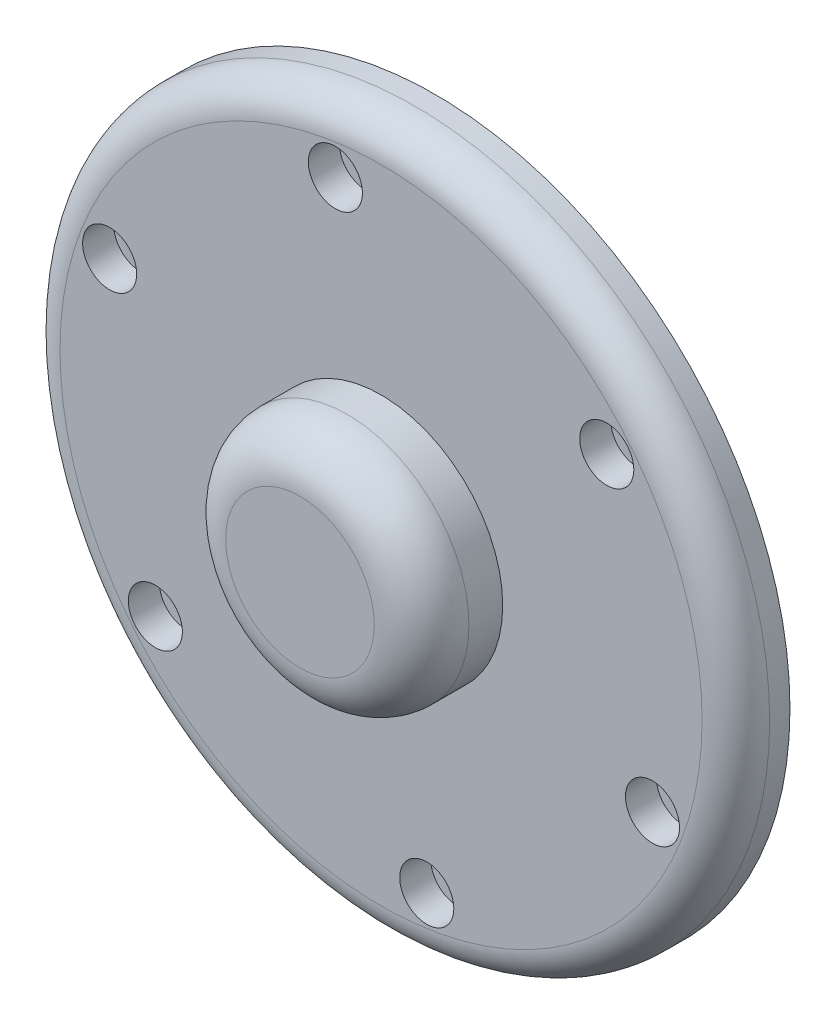
ISO-10303-21;
HEADER;
FILE_DESCRIPTION(('STEP AP214'),'2;1');
FILE_NAME('part.step','',(''),(''),'','','');
FILE_SCHEMA(('AUTOMOTIVE_DESIGN { 1 0 10303 214 1 1 1 1 }'));
ENDSEC;
DATA;
#1=APPLICATION_CONTEXT('core data for automotive mechanical design processes');
#2=APPLICATION_PROTOCOL_DEFINITION('international standard','automotive_design',2000,#1);
#3=PRODUCT_CONTEXT('',#1,'mechanical');
#4=PRODUCT('Part','Part','',(#3));
#5=PRODUCT_RELATED_PRODUCT_CATEGORY('part','',(#4));
#6=PRODUCT_DEFINITION_FORMATION('','',#4);
#7=PRODUCT_DEFINITION_CONTEXT('part definition',#1,'design');
#8=PRODUCT_DEFINITION('design','',#6,#7);
#9=PRODUCT_DEFINITION_SHAPE('','',#8);
#10=(LENGTH_UNIT() NAMED_UNIT(*) SI_UNIT(.MILLI.,.METRE.));
#11=(NAMED_UNIT(*) PLANE_ANGLE_UNIT() SI_UNIT($,.RADIAN.));
#12=(NAMED_UNIT(*) SI_UNIT($,.STERADIAN.) SOLID_ANGLE_UNIT());
#13=UNCERTAINTY_MEASURE_WITH_UNIT(LENGTH_MEASURE(1.E-05),#10,'distance_accuracy_value','');
#14=(GEOMETRIC_REPRESENTATION_CONTEXT(3) GLOBAL_UNCERTAINTY_ASSIGNED_CONTEXT((#13)) GLOBAL_UNIT_ASSIGNED_CONTEXT((#10,
#11,#12)) REPRESENTATION_CONTEXT('',''));
#15=CARTESIAN_POINT('',(0.,0.,0.));
#16=DIRECTION('',(0.,0.,1.));
#17=DIRECTION('',(1.,0.,0.));
#18=AXIS2_PLACEMENT_3D('',#15,#16,#17);
#19=CARTESIAN_POINT('',(0.,0.,20.));
#20=DIRECTION('',(0.,0.,-1.));
#21=DIRECTION('',(-1.,0.,0.));
#22=AXIS2_PLACEMENT_3D('',#19,#20,#21);
#23=CYLINDRICAL_SURFACE('',#22,52.5);
#24=CARTESIAN_POINT('',(0.,0.,3.));
#25=DIRECTION('',(0.,0.,1.));
#26=DIRECTION('',(1.,0.,0.));
#27=AXIS2_PLACEMENT_3D('',#24,#25,#26);
#28=CIRCLE('',#27,52.5);
#29=CARTESIAN_POINT('',(52.5,0.,3.));
#30=VERTEX_POINT('',#29);
#31=EDGE_CURVE('E10',#30,#30,#28,.F.);
#32=ORIENTED_EDGE('',*,*,#31,.T.);
#33=EDGE_LOOP('',(#32));
#34=FACE_BOUND('',#33,.T.);
#35=CARTESIAN_POINT('',(0.,0.,0.));
#36=DIRECTION('',(0.,0.,1.));
#37=DIRECTION('',(1.,0.,0.));
#38=AXIS2_PLACEMENT_3D('',#35,#36,#37);
#39=CIRCLE('',#38,52.5);
#40=CARTESIAN_POINT('',(52.5,0.,0.));
#41=VERTEX_POINT('',#40);
#42=EDGE_CURVE('E63',#41,#41,#39,.T.);
#43=ORIENTED_EDGE('',*,*,#42,.T.);
#44=EDGE_LOOP('',(#43));
#45=FACE_BOUND('',#44,.T.);
#46=ADVANCED_FACE('F44',(#34,#45),#23,.T.);
#47=CARTESIAN_POINT('',(0.,0.,0.));
#48=DIRECTION('',(0.,0.,1.));
#49=DIRECTION('',(1.,0.,0.));
#50=AXIS2_PLACEMENT_3D('',#47,#48,#49);
#51=PLANE('',#50);
#52=CARTESIAN_POINT('',(40.1569010988382,-15.3760623742928,0.));
#53=DIRECTION('',(0.,0.,1.));
#54=DIRECTION('',(0.499999999999998,-0.86602540378444,0.));
#55=AXIS2_PLACEMENT_3D('',#52,#53,#54);
#56=CIRCLE('',#55,2.25);
#57=CARTESIAN_POINT('',(41.2819010988382,-17.3246195328078,0.));
#58=VERTEX_POINT('',#57);
#59=EDGE_CURVE('E144',#58,#58,#56,.T.);
#60=ORIENTED_EDGE('',*,*,#59,.T.);
#61=EDGE_LOOP('',(#60));
#62=FACE_BOUND('',#61,.T.);
#63=CARTESIAN_POINT('',(6.76238992310732,-42.4649276759995,0.));
#64=DIRECTION('',(0.,0.,1.));
#65=DIRECTION('',(-0.500000000000004,-0.866025403784436,0.));
#66=AXIS2_PLACEMENT_3D('',#63,#64,#65);
#67=CIRCLE('',#66,2.25);
#68=CARTESIAN_POINT('',(5.63738992310731,-44.4134848345145,0.));
#69=VERTEX_POINT('',#68);
#70=EDGE_CURVE('E135',#69,#69,#67,.T.);
#71=ORIENTED_EDGE('',*,*,#70,.T.);
#72=EDGE_LOOP('',(#71));
#73=FACE_BOUND('',#72,.T.);
#74=CARTESIAN_POINT('',(-33.3945111757307,-27.0888653017068,0.));
#75=DIRECTION('',(0.,0.,1.));
#76=DIRECTION('',(-1.,0.,0.));
#77=AXIS2_PLACEMENT_3D('',#74,#75,#76);
#78=CIRCLE('',#77,2.25);
#79=CARTESIAN_POINT('',(-35.6445111757307,-27.0888653017068,0.));
#80=VERTEX_POINT('',#79);
#81=EDGE_CURVE('E125',#80,#80,#78,.T.);
#82=ORIENTED_EDGE('',*,*,#81,.T.);
#83=EDGE_LOOP('',(#82));
#84=FACE_BOUND('',#83,.T.);
#85=CARTESIAN_POINT('',(-40.1569010988381,15.3760623742931,0.));
#86=DIRECTION('',(0.,0.,1.));
#87=DIRECTION('',(-0.499999999999992,0.866025403784443,0.));
#88=AXIS2_PLACEMENT_3D('',#85,#86,#87);
#89=CIRCLE('',#88,2.25);
#90=CARTESIAN_POINT('',(-41.281901098838,17.3246195328081,0.));
#91=VERTEX_POINT('',#90);
#92=EDGE_CURVE('E109',#91,#91,#89,.T.);
#93=ORIENTED_EDGE('',*,*,#92,.T.);
#94=EDGE_LOOP('',(#93));
#95=FACE_BOUND('',#94,.T.);
#96=CARTESIAN_POINT('',(-6.76238992310702,42.4649276759996,0.));
#97=DIRECTION('',(0.,0.,1.));
#98=DIRECTION('',(0.50000000000001,0.866025403784433,0.));
#99=AXIS2_PLACEMENT_3D('',#96,#97,#98);
#100=CIRCLE('',#99,2.25);
#101=CARTESIAN_POINT('',(-5.637389923107,44.4134848345146,0.));
#102=VERTEX_POINT('',#101);
#103=EDGE_CURVE('E97',#102,#102,#100,.T.);
#104=ORIENTED_EDGE('',*,*,#103,.T.);
#105=EDGE_LOOP('',(#104));
#106=FACE_BOUND('',#105,.T.);
#107=CARTESIAN_POINT('',(33.3945111757307,27.0888653017068,0.));
#108=DIRECTION('',(0.,0.,1.));
#109=DIRECTION('',(1.,0.,0.));
#110=AXIS2_PLACEMENT_3D('',#107,#108,#109);
#111=CIRCLE('',#110,2.25);
#112=CARTESIAN_POINT('',(35.6445111757307,27.0888653017068,0.));
#113=VERTEX_POINT('',#112);
#114=EDGE_CURVE('E73',#113,#113,#111,.T.);
#115=ORIENTED_EDGE('',*,*,#114,.T.);
#116=EDGE_LOOP('',(#115));
#117=FACE_BOUND('',#116,.T.);
#118=CARTESIAN_POINT('',(0.,0.647267043626235,0.));
#119=DIRECTION('',(0.,0.,-1.));
#120=DIRECTION('',(-1.,0.,0.));
#121=AXIS2_PLACEMENT_3D('',#118,#119,#120);
#122=CIRCLE('',#121,15.25);
#123=CARTESIAN_POINT('',(-15.25,0.647267043626235,0.));
#124=VERTEX_POINT('',#123);
#125=EDGE_CURVE('E74',#124,#124,#122,.T.);
#126=ORIENTED_EDGE('',*,*,#125,.F.);
#127=EDGE_LOOP('',(#126));
#128=FACE_BOUND('',#127,.T.);
#129=ORIENTED_EDGE('',*,*,#42,.F.);
#130=EDGE_LOOP('',(#129));
#131=FACE_BOUND('',#130,.T.);
#132=ADVANCED_FACE('F157',(#62,#73,#84,#95,#106,#117,#128,#131),#51,.F.);
#133=CARTESIAN_POINT('',(0.,0.,8.));
#134=DIRECTION('',(0.,0.,1.));
#135=DIRECTION('',(1.,0.,0.));
#136=AXIS2_PLACEMENT_3D('',#133,#134,#135);
#137=PLANE('',#136);
#138=CARTESIAN_POINT('',(0.,0.,8.));
#139=DIRECTION('',(0.,0.,1.));
#140=DIRECTION('',(1.,0.,0.));
#141=AXIS2_PLACEMENT_3D('',#138,#139,#140);
#142=CIRCLE('',#141,47.5);
#143=CARTESIAN_POINT('',(47.5,0.,8.));
#144=VERTEX_POINT('',#143);
#145=EDGE_CURVE('E55',#144,#144,#142,.T.);
#146=ORIENTED_EDGE('',*,*,#145,.T.);
#147=EDGE_LOOP('',(#146));
#148=FACE_BOUND('',#147,.T.);
#149=CARTESIAN_POINT('',(40.1569010988382,-15.3760623742928,8.));
#150=DIRECTION('',(0.,0.,1.));
#151=DIRECTION('',(0.499999999999998,-0.86602540378444,0.));
#152=AXIS2_PLACEMENT_3D('',#149,#150,#151);
#153=CIRCLE('',#152,4.);
#154=CARTESIAN_POINT('',(42.1569010988382,-18.8401639894306,8.));
#155=VERTEX_POINT('',#154);
#156=EDGE_CURVE('E128',#155,#155,#153,.T.);
#157=ORIENTED_EDGE('',*,*,#156,.F.);
#158=EDGE_LOOP('',(#157));
#159=FACE_BOUND('',#158,.T.);
#160=CARTESIAN_POINT('',(6.76238992310732,-42.4649276759995,8.));
#161=DIRECTION('',(0.,0.,1.));
#162=DIRECTION('',(-0.500000000000004,-0.866025403784436,0.));
#163=AXIS2_PLACEMENT_3D('',#160,#161,#162);
#164=CIRCLE('',#163,4.);
#165=CARTESIAN_POINT('',(4.7623899231073,-45.9290292911373,8.));
#166=VERTEX_POINT('',#165);
#167=EDGE_CURVE('E117',#166,#166,#164,.T.);
#168=ORIENTED_EDGE('',*,*,#167,.F.);
#169=EDGE_LOOP('',(#168));
#170=FACE_BOUND('',#169,.T.);
#171=CARTESIAN_POINT('',(-33.3945111757307,-27.0888653017068,8.));
#172=DIRECTION('',(0.,0.,1.));
#173=DIRECTION('',(-1.,0.,0.));
#174=AXIS2_PLACEMENT_3D('',#171,#172,#173);
#175=CIRCLE('',#174,4.);
#176=CARTESIAN_POINT('',(-37.3945111757307,-27.0888653017068,8.));
#177=VERTEX_POINT('',#176);
#178=EDGE_CURVE('E106',#177,#177,#175,.T.);
#179=ORIENTED_EDGE('',*,*,#178,.F.);
#180=EDGE_LOOP('',(#179));
#181=FACE_BOUND('',#180,.T.);
#182=CARTESIAN_POINT('',(-40.1569010988381,15.3760623742931,8.));
#183=DIRECTION('',(0.,0.,1.));
#184=DIRECTION('',(-0.499999999999992,0.866025403784443,0.));
#185=AXIS2_PLACEMENT_3D('',#182,#183,#184);
#186=CIRCLE('',#185,4.);
#187=CARTESIAN_POINT('',(-42.156901098838,18.8401639894309,8.));
#188=VERTEX_POINT('',#187);
#189=EDGE_CURVE('E95',#188,#188,#186,.T.);
#190=ORIENTED_EDGE('',*,*,#189,.F.);
#191=EDGE_LOOP('',(#190));
#192=FACE_BOUND('',#191,.T.);
#193=CARTESIAN_POINT('',(-6.76238992310702,42.4649276759996,8.));
#194=DIRECTION('',(0.,0.,1.));
#195=DIRECTION('',(0.50000000000001,0.866025403784433,0.));
#196=AXIS2_PLACEMENT_3D('',#193,#194,#195);
#197=CIRCLE('',#196,4.);
#198=CARTESIAN_POINT('',(-4.76238992310698,45.9290292911373,8.));
#199=VERTEX_POINT('',#198);
#200=EDGE_CURVE('E99',#199,#199,#197,.T.);
#201=ORIENTED_EDGE('',*,*,#200,.F.);
#202=EDGE_LOOP('',(#201));
#203=FACE_BOUND('',#202,.T.);
#204=CARTESIAN_POINT('',(33.3945111757307,27.0888653017068,8.));
#205=DIRECTION('',(0.,0.,1.));
#206=DIRECTION('',(1.,0.,0.));
#207=AXIS2_PLACEMENT_3D('',#204,#205,#206);
#208=CIRCLE('',#207,4.);
#209=CARTESIAN_POINT('',(37.3945111757307,27.0888653017068,8.));
#210=VERTEX_POINT('',#209);
#211=EDGE_CURVE('E88',#210,#210,#208,.T.);
#212=ORIENTED_EDGE('',*,*,#211,.F.);
#213=EDGE_LOOP('',(#212));
#214=FACE_BOUND('',#213,.T.);
#215=CARTESIAN_POINT('',(0.,0.,8.));
#216=DIRECTION('',(0.,0.,1.));
#217=DIRECTION('',(1.,0.,0.));
#218=AXIS2_PLACEMENT_3D('',#215,#216,#217);
#219=CIRCLE('',#218,18.);
#220=CARTESIAN_POINT('',(18.,0.,8.));
#221=VERTEX_POINT('',#220);
#222=EDGE_CURVE('E67',#221,#221,#219,.T.);
#223=ORIENTED_EDGE('',*,*,#222,.F.);
#224=EDGE_LOOP('',(#223));
#225=FACE_BOUND('',#224,.T.);
#226=ADVANCED_FACE('F154',(#148,#159,#170,#181,#192,#203,#214,#225),#137,.T.);
#227=CARTESIAN_POINT('',(0.,0.,8.));
#228=DIRECTION('',(0.,0.,1.));
#229=DIRECTION('',(1.,0.,0.));
#230=AXIS2_PLACEMENT_3D('',#227,#228,#229);
#231=CYLINDRICAL_SURFACE('',#230,18.);
#232=CARTESIAN_POINT('',(0.,0.,13.));
#233=DIRECTION('',(0.,0.,1.));
#234=DIRECTION('',(1.,0.,0.));
#235=AXIS2_PLACEMENT_3D('',#232,#233,#234);
#236=CIRCLE('',#235,18.);
#237=CARTESIAN_POINT('',(18.,0.,13.));
#238=VERTEX_POINT('',#237);
#239=EDGE_CURVE('E57',#238,#238,#236,.F.);
#240=ORIENTED_EDGE('',*,*,#239,.T.);
#241=EDGE_LOOP('',(#240));
#242=FACE_BOUND('',#241,.T.);
#243=ORIENTED_EDGE('',*,*,#222,.T.);
#244=EDGE_LOOP('',(#243));
#245=FACE_BOUND('',#244,.T.);
#246=ADVANCED_FACE('F151',(#242,#245),#231,.T.);
#247=CARTESIAN_POINT('',(0.,0.,20.));
#248=DIRECTION('',(0.,0.,1.));
#249=DIRECTION('',(1.,0.,0.));
#250=AXIS2_PLACEMENT_3D('',#247,#248,#249);
#251=PLANE('',#250);
#252=CARTESIAN_POINT('',(0.,0.,20.));
#253=DIRECTION('',(0.,0.,1.));
#254=DIRECTION('',(1.,0.,0.));
#255=AXIS2_PLACEMENT_3D('',#252,#253,#254);
#256=CIRCLE('',#255,11.);
#257=CARTESIAN_POINT('',(11.,0.,20.));
#258=VERTEX_POINT('',#257);
#259=EDGE_CURVE('E58',#258,#258,#256,.T.);
#260=ORIENTED_EDGE('',*,*,#259,.T.);
#261=EDGE_LOOP('',(#260));
#262=FACE_BOUND('',#261,.T.);
#263=ADVANCED_FACE('F171',(#262),#251,.T.);
#264=CARTESIAN_POINT('',(0.,0.647267043626235,17.5));
#265=DIRECTION('',(0.,0.,-1.));
#266=DIRECTION('',(-1.,0.,0.));
#267=AXIS2_PLACEMENT_3D('',#264,#265,#266);
#268=CYLINDRICAL_SURFACE('',#267,15.25);
#269=CARTESIAN_POINT('',(0.,0.647267043626235,17.5));
#270=DIRECTION('',(0.,0.,-1.));
#271=DIRECTION('',(-1.,0.,0.));
#272=AXIS2_PLACEMENT_3D('',#269,#270,#271);
#273=CIRCLE('',#272,15.25);
#274=CARTESIAN_POINT('',(-15.25,0.647267043626235,17.5));
#275=VERTEX_POINT('',#274);
#276=EDGE_CURVE('E72',#275,#275,#273,.T.);
#277=ORIENTED_EDGE('',*,*,#276,.F.);
#278=EDGE_LOOP('',(#277));
#279=FACE_BOUND('',#278,.T.);
#280=ORIENTED_EDGE('',*,*,#125,.T.);
#281=EDGE_LOOP('',(#280));
#282=FACE_BOUND('',#281,.T.);
#283=ADVANCED_FACE('F178',(#279,#282),#268,.F.);
#284=CARTESIAN_POINT('',(0.,0.647267043626235,17.5));
#285=DIRECTION('',(0.,0.,-1.));
#286=DIRECTION('',(-1.,0.,0.));
#287=AXIS2_PLACEMENT_3D('',#284,#285,#286);
#288=PLANE('',#287);
#289=ORIENTED_EDGE('',*,*,#276,.T.);
#290=EDGE_LOOP('',(#289));
#291=FACE_BOUND('',#290,.T.);
#292=ADVANCED_FACE('F271',(#291),#288,.T.);
#293=CARTESIAN_POINT('',(33.3945111757307,27.0888653017068,8.));
#294=DIRECTION('',(0.,0.,1.));
#295=DIRECTION('',(1.,0.,0.));
#296=AXIS2_PLACEMENT_3D('',#293,#294,#295);
#297=CYLINDRICAL_SURFACE('',#296,2.25);
#298=ORIENTED_EDGE('',*,*,#114,.F.);
#299=EDGE_LOOP('',(#298));
#300=FACE_BOUND('',#299,.T.);
#301=CARTESIAN_POINT('',(33.3945111757307,27.0888653017068,3.4));
#302=DIRECTION('',(0.,0.,1.));
#303=DIRECTION('',(1.,0.,0.));
#304=AXIS2_PLACEMENT_3D('',#301,#302,#303);
#305=CIRCLE('',#304,2.25);
#306=CARTESIAN_POINT('',(35.6445111757307,27.0888653017068,3.4));
#307=VERTEX_POINT('',#306);
#308=EDGE_CURVE('E78',#307,#307,#305,.T.);
#309=ORIENTED_EDGE('',*,*,#308,.T.);
#310=EDGE_LOOP('',(#309));
#311=FACE_BOUND('',#310,.T.);
#312=ADVANCED_FACE('F266',(#300,#311),#297,.F.);
#313=CARTESIAN_POINT('',(35.6445111757307,27.0888653017068,3.4));
#314=DIRECTION('',(0.,0.,-1.));
#315=DIRECTION('',(-1.,0.,0.));
#316=AXIS2_PLACEMENT_3D('',#313,#314,#315);
#317=PLANE('',#316);
#318=ORIENTED_EDGE('',*,*,#308,.F.);
#319=EDGE_LOOP('',(#318));
#320=FACE_BOUND('',#319,.T.);
#321=CARTESIAN_POINT('',(33.3945111757307,27.0888653017068,3.4));
#322=DIRECTION('',(0.,0.,1.));
#323=DIRECTION('',(1.,0.,0.));
#324=AXIS2_PLACEMENT_3D('',#321,#322,#323);
#325=CIRCLE('',#324,4.);
#326=CARTESIAN_POINT('',(37.3945111757307,27.0888653017068,3.4));
#327=VERTEX_POINT('',#326);
#328=EDGE_CURVE('E84',#327,#327,#325,.T.);
#329=ORIENTED_EDGE('',*,*,#328,.T.);
#330=EDGE_LOOP('',(#329));
#331=FACE_BOUND('',#330,.T.);
#332=ADVANCED_FACE('F261',(#320,#331),#317,.F.);
#333=CARTESIAN_POINT('',(33.3945111757307,27.0888653017068,8.));
#334=DIRECTION('',(0.,0.,1.));
#335=DIRECTION('',(1.,0.,0.));
#336=AXIS2_PLACEMENT_3D('',#333,#334,#335);
#337=CYLINDRICAL_SURFACE('',#336,4.);
#338=ORIENTED_EDGE('',*,*,#328,.F.);
#339=EDGE_LOOP('',(#338));
#340=FACE_BOUND('',#339,.T.);
#341=ORIENTED_EDGE('',*,*,#211,.T.);
#342=EDGE_LOOP('',(#341));
#343=FACE_BOUND('',#342,.T.);
#344=ADVANCED_FACE('F263',(#340,#343),#337,.F.);
#345=CARTESIAN_POINT('',(-6.76238992310702,42.4649276759996,8.));
#346=DIRECTION('',(0.,0.,1.));
#347=DIRECTION('',(0.50000000000001,0.866025403784433,0.));
#348=AXIS2_PLACEMENT_3D('',#345,#346,#347);
#349=CYLINDRICAL_SURFACE('',#348,2.25);
#350=ORIENTED_EDGE('',*,*,#103,.F.);
#351=EDGE_LOOP('',(#350));
#352=FACE_BOUND('',#351,.T.);
#353=CARTESIAN_POINT('',(-6.76238992310702,42.4649276759996,3.4));
#354=DIRECTION('',(0.,0.,1.));
#355=DIRECTION('',(0.50000000000001,0.866025403784433,0.));
#356=AXIS2_PLACEMENT_3D('',#353,#354,#355);
#357=CIRCLE('',#356,2.25);
#358=CARTESIAN_POINT('',(-5.637389923107,44.4134848345146,3.4));
#359=VERTEX_POINT('',#358);
#360=EDGE_CURVE('E86',#359,#359,#357,.T.);
#361=ORIENTED_EDGE('',*,*,#360,.T.);
#362=EDGE_LOOP('',(#361));
#363=FACE_BOUND('',#362,.T.);
#364=ADVANCED_FACE('F260',(#352,#363),#349,.F.);
#365=CARTESIAN_POINT('',(-5.637389923107,44.4134848345146,3.4));
#366=DIRECTION('',(0.,0.,-1.));
#367=DIRECTION('',(-0.50000000000001,-0.866025403784433,0.));
#368=AXIS2_PLACEMENT_3D('',#365,#366,#367);
#369=PLANE('',#368);
#370=ORIENTED_EDGE('',*,*,#360,.F.);
#371=EDGE_LOOP('',(#370));
#372=FACE_BOUND('',#371,.T.);
#373=CARTESIAN_POINT('',(-6.76238992310702,42.4649276759996,3.4));
#374=DIRECTION('',(0.,0.,1.));
#375=DIRECTION('',(0.50000000000001,0.866025403784433,0.));
#376=AXIS2_PLACEMENT_3D('',#373,#374,#375);
#377=CIRCLE('',#376,4.);
#378=CARTESIAN_POINT('',(-4.76238992310698,45.9290292911373,3.4));
#379=VERTEX_POINT('',#378);
#380=EDGE_CURVE('E91',#379,#379,#377,.T.);
#381=ORIENTED_EDGE('',*,*,#380,.T.);
#382=EDGE_LOOP('',(#381));
#383=FACE_BOUND('',#382,.T.);
#384=ADVANCED_FACE('F254',(#372,#383),#369,.F.);
#385=CARTESIAN_POINT('',(-6.76238992310702,42.4649276759996,8.));
#386=DIRECTION('',(0.,0.,1.));
#387=DIRECTION('',(0.50000000000001,0.866025403784433,0.));
#388=AXIS2_PLACEMENT_3D('',#385,#386,#387);
#389=CYLINDRICAL_SURFACE('',#388,4.);
#390=ORIENTED_EDGE('',*,*,#380,.F.);
#391=EDGE_LOOP('',(#390));
#392=FACE_BOUND('',#391,.T.);
#393=ORIENTED_EDGE('',*,*,#200,.T.);
#394=EDGE_LOOP('',(#393));
#395=FACE_BOUND('',#394,.T.);
#396=ADVANCED_FACE('F248',(#392,#395),#389,.F.);
#397=CARTESIAN_POINT('',(-40.1569010988381,15.3760623742931,8.));
#398=DIRECTION('',(0.,0.,1.));
#399=DIRECTION('',(-0.499999999999992,0.866025403784443,0.));
#400=AXIS2_PLACEMENT_3D('',#397,#398,#399);
#401=CYLINDRICAL_SURFACE('',#400,2.25);
#402=ORIENTED_EDGE('',*,*,#92,.F.);
#403=EDGE_LOOP('',(#402));
#404=FACE_BOUND('',#403,.T.);
#405=CARTESIAN_POINT('',(-40.1569010988381,15.3760623742931,3.4));
#406=DIRECTION('',(0.,0.,1.));
#407=DIRECTION('',(-0.499999999999992,0.866025403784443,0.));
#408=AXIS2_PLACEMENT_3D('',#405,#406,#407);
#409=CIRCLE('',#408,2.25);
#410=CARTESIAN_POINT('',(-41.281901098838,17.3246195328081,3.4));
#411=VERTEX_POINT('',#410);
#412=EDGE_CURVE('E101',#411,#411,#409,.T.);
#413=ORIENTED_EDGE('',*,*,#412,.T.);
#414=EDGE_LOOP('',(#413));
#415=FACE_BOUND('',#414,.T.);
#416=ADVANCED_FACE('F244',(#404,#415),#401,.F.);
#417=CARTESIAN_POINT('',(-41.2819010988381,17.3246195328081,3.4));
#418=DIRECTION('',(0.,0.,-1.));
#419=DIRECTION('',(0.499999999999992,-0.866025403784443,0.));
#420=AXIS2_PLACEMENT_3D('',#417,#418,#419);
#421=PLANE('',#420);
#422=ORIENTED_EDGE('',*,*,#412,.F.);
#423=EDGE_LOOP('',(#422));
#424=FACE_BOUND('',#423,.T.);
#425=CARTESIAN_POINT('',(-40.1569010988381,15.3760623742931,3.4));
#426=DIRECTION('',(0.,0.,1.));
#427=DIRECTION('',(-0.499999999999992,0.866025403784443,0.));
#428=AXIS2_PLACEMENT_3D('',#425,#426,#427);
#429=CIRCLE('',#428,4.);
#430=CARTESIAN_POINT('',(-42.156901098838,18.8401639894309,3.4));
#431=VERTEX_POINT('',#430);
#432=EDGE_CURVE('E110',#431,#431,#429,.T.);
#433=ORIENTED_EDGE('',*,*,#432,.T.);
#434=EDGE_LOOP('',(#433));
#435=FACE_BOUND('',#434,.T.);
#436=ADVANCED_FACE('F241',(#424,#435),#421,.F.);
#437=CARTESIAN_POINT('',(-40.1569010988381,15.3760623742931,8.));
#438=DIRECTION('',(0.,0.,1.));
#439=DIRECTION('',(-0.499999999999992,0.866025403784443,0.));
#440=AXIS2_PLACEMENT_3D('',#437,#438,#439);
#441=CYLINDRICAL_SURFACE('',#440,4.);
#442=ORIENTED_EDGE('',*,*,#432,.F.);
#443=EDGE_LOOP('',(#442));
#444=FACE_BOUND('',#443,.T.);
#445=ORIENTED_EDGE('',*,*,#189,.T.);
#446=EDGE_LOOP('',(#445));
#447=FACE_BOUND('',#446,.T.);
#448=ADVANCED_FACE('F240',(#444,#447),#441,.F.);
#449=CARTESIAN_POINT('',(-33.3945111757307,-27.0888653017068,8.));
#450=DIRECTION('',(0.,0.,1.));
#451=DIRECTION('',(-1.,0.,0.));
#452=AXIS2_PLACEMENT_3D('',#449,#450,#451);
#453=CYLINDRICAL_SURFACE('',#452,2.25);
#454=ORIENTED_EDGE('',*,*,#81,.F.);
#455=EDGE_LOOP('',(#454));
#456=FACE_BOUND('',#455,.T.);
#457=CARTESIAN_POINT('',(-33.3945111757307,-27.0888653017068,3.4));
#458=DIRECTION('',(0.,0.,1.));
#459=DIRECTION('',(-1.,0.,0.));
#460=AXIS2_PLACEMENT_3D('',#457,#458,#459);
#461=CIRCLE('',#460,2.25);
#462=CARTESIAN_POINT('',(-35.6445111757307,-27.0888653017068,3.4));
#463=VERTEX_POINT('',#462);
#464=EDGE_CURVE('E114',#463,#463,#461,.T.);
#465=ORIENTED_EDGE('',*,*,#464,.T.);
#466=EDGE_LOOP('',(#465));
#467=FACE_BOUND('',#466,.T.);
#468=ADVANCED_FACE('F231',(#456,#467),#453,.F.);
#469=CARTESIAN_POINT('',(-35.6445111757307,-27.0888653017068,3.4));
#470=DIRECTION('',(0.,0.,-1.));
#471=DIRECTION('',(1.,0.,0.));
#472=AXIS2_PLACEMENT_3D('',#469,#470,#471);
#473=PLANE('',#472);
#474=ORIENTED_EDGE('',*,*,#464,.F.);
#475=EDGE_LOOP('',(#474));
#476=FACE_BOUND('',#475,.T.);
#477=CARTESIAN_POINT('',(-33.3945111757307,-27.0888653017068,3.4));
#478=DIRECTION('',(0.,0.,1.));
#479=DIRECTION('',(-1.,0.,0.));
#480=AXIS2_PLACEMENT_3D('',#477,#478,#479);
#481=CIRCLE('',#480,4.);
#482=CARTESIAN_POINT('',(-37.3945111757307,-27.0888653017068,3.4));
#483=VERTEX_POINT('',#482);
#484=EDGE_CURVE('E118',#483,#483,#481,.T.);
#485=ORIENTED_EDGE('',*,*,#484,.T.);
#486=EDGE_LOOP('',(#485));
#487=FACE_BOUND('',#486,.T.);
#488=ADVANCED_FACE('F230',(#476,#487),#473,.F.);
#489=CARTESIAN_POINT('',(-33.3945111757307,-27.0888653017068,8.));
#490=DIRECTION('',(0.,0.,1.));
#491=DIRECTION('',(-1.,0.,0.));
#492=AXIS2_PLACEMENT_3D('',#489,#490,#491);
#493=CYLINDRICAL_SURFACE('',#492,4.);
#494=ORIENTED_EDGE('',*,*,#484,.F.);
#495=EDGE_LOOP('',(#494));
#496=FACE_BOUND('',#495,.T.);
#497=ORIENTED_EDGE('',*,*,#178,.T.);
#498=EDGE_LOOP('',(#497));
#499=FACE_BOUND('',#498,.T.);
#500=ADVANCED_FACE('F223',(#496,#499),#493,.F.);
#501=CARTESIAN_POINT('',(6.76238992310732,-42.4649276759995,8.));
#502=DIRECTION('',(0.,0.,1.));
#503=DIRECTION('',(-0.500000000000004,-0.866025403784436,0.));
#504=AXIS2_PLACEMENT_3D('',#501,#502,#503);
#505=CYLINDRICAL_SURFACE('',#504,2.25);
#506=ORIENTED_EDGE('',*,*,#70,.F.);
#507=EDGE_LOOP('',(#506));
#508=FACE_BOUND('',#507,.T.);
#509=CARTESIAN_POINT('',(6.76238992310732,-42.4649276759995,3.4));
#510=DIRECTION('',(0.,0.,1.));
#511=DIRECTION('',(-0.500000000000004,-0.866025403784436,0.));
#512=AXIS2_PLACEMENT_3D('',#509,#510,#511);
#513=CIRCLE('',#512,2.25);
#514=CARTESIAN_POINT('',(5.63738992310731,-44.4134848345145,3.4));
#515=VERTEX_POINT('',#514);
#516=EDGE_CURVE('E130',#515,#515,#513,.T.);
#517=ORIENTED_EDGE('',*,*,#516,.T.);
#518=EDGE_LOOP('',(#517));
#519=FACE_BOUND('',#518,.T.);
#520=ADVANCED_FACE('F222',(#508,#519),#505,.F.);
#521=CARTESIAN_POINT('',(5.63738992310731,-44.4134848345145,3.4));
#522=DIRECTION('',(0.,0.,-1.));
#523=DIRECTION('',(0.500000000000004,0.866025403784436,0.));
#524=AXIS2_PLACEMENT_3D('',#521,#522,#523);
#525=PLANE('',#524);
#526=ORIENTED_EDGE('',*,*,#516,.F.);
#527=EDGE_LOOP('',(#526));
#528=FACE_BOUND('',#527,.T.);
#529=CARTESIAN_POINT('',(6.76238992310732,-42.4649276759995,3.4));
#530=DIRECTION('',(0.,0.,1.));
#531=DIRECTION('',(-0.500000000000004,-0.866025403784436,0.));
#532=AXIS2_PLACEMENT_3D('',#529,#530,#531);
#533=CIRCLE('',#532,4.);
#534=CARTESIAN_POINT('',(4.7623899231073,-45.9290292911373,3.4));
#535=VERTEX_POINT('',#534);
#536=EDGE_CURVE('E133',#535,#535,#533,.T.);
#537=ORIENTED_EDGE('',*,*,#536,.T.);
#538=EDGE_LOOP('',(#537));
#539=FACE_BOUND('',#538,.T.);
#540=ADVANCED_FACE('F219',(#528,#539),#525,.F.);
#541=CARTESIAN_POINT('',(6.76238992310732,-42.4649276759995,8.));
#542=DIRECTION('',(0.,0.,1.));
#543=DIRECTION('',(-0.500000000000004,-0.866025403784436,0.));
#544=AXIS2_PLACEMENT_3D('',#541,#542,#543);
#545=CYLINDRICAL_SURFACE('',#544,4.);
#546=ORIENTED_EDGE('',*,*,#536,.F.);
#547=EDGE_LOOP('',(#546));
#548=FACE_BOUND('',#547,.T.);
#549=ORIENTED_EDGE('',*,*,#167,.T.);
#550=EDGE_LOOP('',(#549));
#551=FACE_BOUND('',#550,.T.);
#552=ADVANCED_FACE('F214',(#548,#551),#545,.F.);
#553=CARTESIAN_POINT('',(40.1569010988382,-15.3760623742928,8.));
#554=DIRECTION('',(0.,0.,1.));
#555=DIRECTION('',(0.499999999999998,-0.86602540378444,0.));
#556=AXIS2_PLACEMENT_3D('',#553,#554,#555);
#557=CYLINDRICAL_SURFACE('',#556,2.25);
#558=ORIENTED_EDGE('',*,*,#59,.F.);
#559=EDGE_LOOP('',(#558));
#560=FACE_BOUND('',#559,.T.);
#561=CARTESIAN_POINT('',(40.1569010988382,-15.3760623742928,3.4));
#562=DIRECTION('',(0.,0.,1.));
#563=DIRECTION('',(0.499999999999998,-0.86602540378444,0.));
#564=AXIS2_PLACEMENT_3D('',#561,#562,#563);
#565=CIRCLE('',#564,2.25);
#566=CARTESIAN_POINT('',(41.2819010988382,-17.3246195328078,3.4));
#567=VERTEX_POINT('',#566);
#568=EDGE_CURVE('E90',#567,#567,#565,.T.);
#569=ORIENTED_EDGE('',*,*,#568,.T.);
#570=EDGE_LOOP('',(#569));
#571=FACE_BOUND('',#570,.T.);
#572=ADVANCED_FACE('F207',(#560,#571),#557,.F.);
#573=CARTESIAN_POINT('',(41.2819010988382,-17.3246195328078,3.4));
#574=DIRECTION('',(0.,0.,-1.));
#575=DIRECTION('',(-0.499999999999998,0.86602540378444,0.));
#576=AXIS2_PLACEMENT_3D('',#573,#574,#575);
#577=PLANE('',#576);
#578=ORIENTED_EDGE('',*,*,#568,.F.);
#579=EDGE_LOOP('',(#578));
#580=FACE_BOUND('',#579,.T.);
#581=CARTESIAN_POINT('',(40.1569010988382,-15.3760623742928,3.4));
#582=DIRECTION('',(0.,0.,1.));
#583=DIRECTION('',(0.499999999999998,-0.86602540378444,0.));
#584=AXIS2_PLACEMENT_3D('',#581,#582,#583);
#585=CIRCLE('',#584,4.);
#586=CARTESIAN_POINT('',(42.1569010988382,-18.8401639894306,3.4));
#587=VERTEX_POINT('',#586);
#588=EDGE_CURVE('E142',#587,#587,#585,.T.);
#589=ORIENTED_EDGE('',*,*,#588,.T.);
#590=EDGE_LOOP('',(#589));
#591=FACE_BOUND('',#590,.T.);
#592=ADVANCED_FACE('F199',(#580,#591),#577,.F.);
#593=CARTESIAN_POINT('',(40.1569010988382,-15.3760623742928,8.));
#594=DIRECTION('',(0.,0.,1.));
#595=DIRECTION('',(0.499999999999998,-0.86602540378444,0.));
#596=AXIS2_PLACEMENT_3D('',#593,#594,#595);
#597=CYLINDRICAL_SURFACE('',#596,4.);
#598=ORIENTED_EDGE('',*,*,#588,.F.);
#599=EDGE_LOOP('',(#598));
#600=FACE_BOUND('',#599,.T.);
#601=ORIENTED_EDGE('',*,*,#156,.T.);
#602=EDGE_LOOP('',(#601));
#603=FACE_BOUND('',#602,.T.);
#604=ADVANCED_FACE('F148',(#600,#603),#597,.F.);
#605=CARTESIAN_POINT('',(0.,0.,13.));
#606=DIRECTION('',(0.,0.,1.));
#607=DIRECTION('',(1.,0.,0.));
#608=AXIS2_PLACEMENT_3D('',#605,#606,#607);
#609=TOROIDAL_SURFACE('',#608,11.,7.);
#610=ORIENTED_EDGE('',*,*,#239,.F.);
#611=EDGE_LOOP('',(#610));
#612=FACE_BOUND('',#611,.T.);
#613=ORIENTED_EDGE('',*,*,#259,.F.);
#614=EDGE_LOOP('',(#613));
#615=FACE_BOUND('',#614,.T.);
#616=ADVANCED_FACE('F192',(#612,#615),#609,.T.);
#617=CARTESIAN_POINT('',(0.,0.,3.));
#618=DIRECTION('',(0.,0.,1.));
#619=DIRECTION('',(1.,0.,0.));
#620=AXIS2_PLACEMENT_3D('',#617,#618,#619);
#621=TOROIDAL_SURFACE('',#620,47.5,5.);
#622=ORIENTED_EDGE('',*,*,#31,.F.);
#623=EDGE_LOOP('',(#622));
#624=FACE_BOUND('',#623,.T.);
#625=ORIENTED_EDGE('',*,*,#145,.F.);
#626=EDGE_LOOP('',(#625));
#627=FACE_BOUND('',#626,.T.);
#628=ADVANCED_FACE('F50',(#624,#627),#621,.T.);
#629=CLOSED_SHELL('',(#46,#132,#226,#246,#263,#283,#292,#312,#332,#344,#364,#384,#396,#416,#436,
#448,#468,#488,#500,#520,#540,#552,#572,#592,#604,#616,#628));
#630=MANIFOLD_SOLID_BREP('B2',#629);
#631=ADVANCED_BREP_SHAPE_REPRESENTATION('',(#18,#630),#14);
#632=SHAPE_DEFINITION_REPRESENTATION(#9,#631);
ENDSEC;
END-ISO-10303-21;
